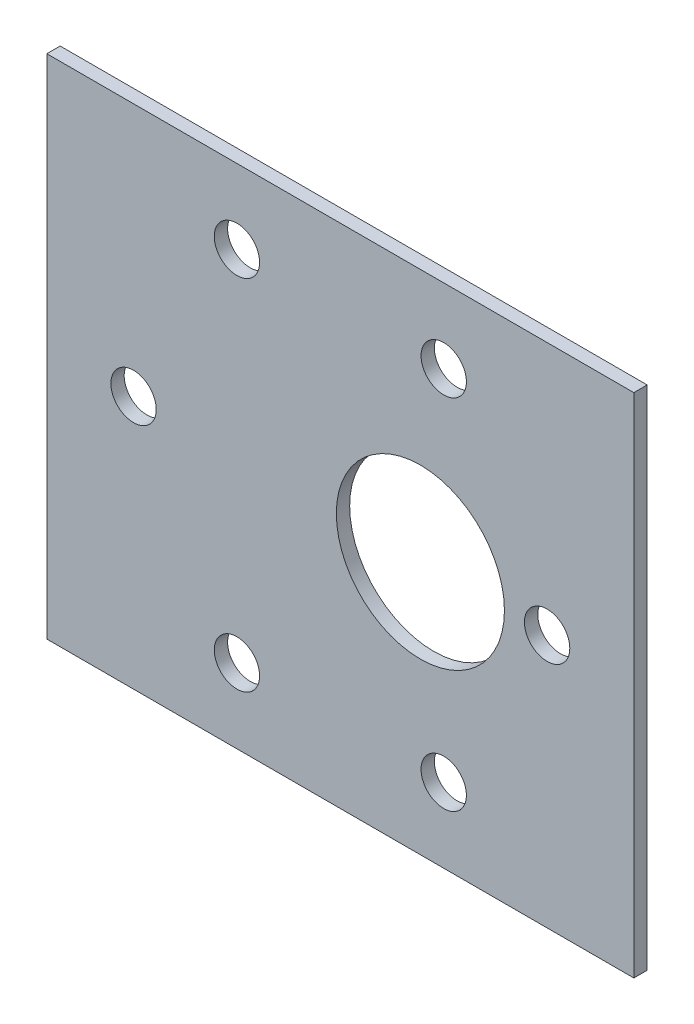
ISO-10303-21;
HEADER;
FILE_DESCRIPTION(('STEP AP214'),'2;1');
FILE_NAME('part.step','',(''),(''),'','','');
FILE_SCHEMA(('AUTOMOTIVE_DESIGN { 1 0 10303 214 1 1 1 1 }'));
ENDSEC;
DATA;
#1=APPLICATION_CONTEXT('core data for automotive mechanical design processes');
#2=APPLICATION_PROTOCOL_DEFINITION('international standard','automotive_design',2000,#1);
#3=PRODUCT_CONTEXT('',#1,'mechanical');
#4=PRODUCT('Part','Part','',(#3));
#5=PRODUCT_RELATED_PRODUCT_CATEGORY('part','',(#4));
#6=PRODUCT_DEFINITION_FORMATION('','',#4);
#7=PRODUCT_DEFINITION_CONTEXT('part definition',#1,'design');
#8=PRODUCT_DEFINITION('design','',#6,#7);
#9=PRODUCT_DEFINITION_SHAPE('','',#8);
#10=(LENGTH_UNIT() NAMED_UNIT(*) SI_UNIT(.MILLI.,.METRE.));
#11=(NAMED_UNIT(*) PLANE_ANGLE_UNIT() SI_UNIT($,.RADIAN.));
#12=(NAMED_UNIT(*) SI_UNIT($,.STERADIAN.) SOLID_ANGLE_UNIT());
#13=UNCERTAINTY_MEASURE_WITH_UNIT(LENGTH_MEASURE(1.E-05),#10,'distance_accuracy_value','');
#14=(GEOMETRIC_REPRESENTATION_CONTEXT(3) GLOBAL_UNCERTAINTY_ASSIGNED_CONTEXT((#13)) GLOBAL_UNIT_ASSIGNED_CONTEXT((#10,
#11,#12)) REPRESENTATION_CONTEXT('',''));
#15=CARTESIAN_POINT('',(0.,0.,0.));
#16=DIRECTION('',(0.,0.,1.));
#17=DIRECTION('',(1.,0.,0.));
#18=AXIS2_PLACEMENT_3D('',#15,#16,#17);
#19=CARTESIAN_POINT('',(0.,0.,1.));
#20=DIRECTION('',(0.,0.,1.));
#21=DIRECTION('',(1.,0.,0.));
#22=AXIS2_PLACEMENT_3D('',#19,#20,#21);
#23=PLANE('',#22);
#24=CARTESIAN_POINT('',(-13.75,15.076606241,1.));
#25=DIRECTION('',(0.,0.,1.));
#26=DIRECTION('',(1.,0.,0.));
#27=AXIS2_PLACEMENT_3D('',#24,#25,#26);
#28=CIRCLE('',#27,1.7);
#29=CARTESIAN_POINT('',(-12.05,15.076606241,1.));
#30=VERTEX_POINT('',#29);
#31=EDGE_CURVE('E145',#30,#30,#28,.T.);
#32=ORIENTED_EDGE('',*,*,#31,.F.);
#33=EDGE_LOOP('',(#32));
#34=FACE_BOUND('',#33,.T.);
#35=CARTESIAN_POINT('',(-13.75,41.923393759,1.));
#36=DIRECTION('',(0.,0.,1.));
#37=DIRECTION('',(1.,0.,0.));
#38=AXIS2_PLACEMENT_3D('',#35,#36,#37);
#39=CIRCLE('',#38,1.7);
#40=CARTESIAN_POINT('',(-12.05,41.923393759,1.));
#41=VERTEX_POINT('',#40);
#42=EDGE_CURVE('E133',#41,#41,#39,.T.);
#43=ORIENTED_EDGE('',*,*,#42,.F.);
#44=EDGE_LOOP('',(#43));
#45=FACE_BOUND('',#44,.T.);
#46=CARTESIAN_POINT('',(9.5,28.5,1.));
#47=DIRECTION('',(0.,0.,1.));
#48=DIRECTION('',(1.,0.,0.));
#49=AXIS2_PLACEMENT_3D('',#46,#47,#48);
#50=CIRCLE('',#49,1.7);
#51=CARTESIAN_POINT('',(11.2,28.5,1.));
#52=VERTEX_POINT('',#51);
#53=EDGE_CURVE('E121',#52,#52,#50,.T.);
#54=ORIENTED_EDGE('',*,*,#53,.F.);
#55=EDGE_LOOP('',(#54));
#56=FACE_BOUND('',#55,.T.);
#57=DIRECTION('',(0.,-1.,0.));
#58=VECTOR('',#57,1.);
#59=CARTESIAN_POINT('',(-28.,47.5,1.));
#60=LINE('',#59,#58);
#61=CARTESIAN_POINT('',(-28.,47.5,1.));
#62=VERTEX_POINT('',#61);
#63=CARTESIAN_POINT('',(-28.,9.5,1.));
#64=VERTEX_POINT('',#63);
#65=EDGE_CURVE('E91',#62,#64,#60,.T.);
#66=ORIENTED_EDGE('',*,*,#65,.T.);
#67=DIRECTION('',(1.,0.,0.));
#68=VECTOR('',#67,1.);
#69=CARTESIAN_POINT('',(-28.,9.5,1.));
#70=LINE('',#69,#68);
#71=CARTESIAN_POINT('',(16.,9.5,1.));
#72=VERTEX_POINT('',#71);
#73=EDGE_CURVE('E86',#64,#72,#70,.T.);
#74=ORIENTED_EDGE('',*,*,#73,.T.);
#75=DIRECTION('',(0.,1.,0.));
#76=VECTOR('',#75,1.);
#77=CARTESIAN_POINT('',(16.,9.5,1.));
#78=LINE('',#77,#76);
#79=CARTESIAN_POINT('',(16.,47.5,1.));
#80=VERTEX_POINT('',#79);
#81=EDGE_CURVE('E89',#72,#80,#78,.T.);
#82=ORIENTED_EDGE('',*,*,#81,.T.);
#83=DIRECTION('',(-1.,0.,0.));
#84=VECTOR('',#83,1.);
#85=CARTESIAN_POINT('',(16.,47.5,1.));
#86=LINE('',#85,#84);
#87=EDGE_CURVE('E56',#80,#62,#86,.T.);
#88=ORIENTED_EDGE('',*,*,#87,.T.);
#89=EDGE_LOOP('',(#66,#74,#82,#88));
#90=FACE_BOUND('',#89,.T.);
#91=CARTESIAN_POINT('',(0.,28.5,1.));
#92=DIRECTION('',(0.,0.,1.));
#93=DIRECTION('',(1.,0.,0.));
#94=AXIS2_PLACEMENT_3D('',#91,#92,#93);
#95=CIRCLE('',#94,6.3);
#96=CARTESIAN_POINT('',(6.3,28.5,1.));
#97=VERTEX_POINT('',#96);
#98=EDGE_CURVE('E106',#97,#97,#95,.T.);
#99=ORIENTED_EDGE('',*,*,#98,.F.);
#100=EDGE_LOOP('',(#99));
#101=FACE_BOUND('',#100,.T.);
#102=CARTESIAN_POINT('',(1.75,41.923393759,1.));
#103=DIRECTION('',(0.,0.,1.));
#104=DIRECTION('',(1.,0.,0.));
#105=AXIS2_PLACEMENT_3D('',#102,#103,#104);
#106=CIRCLE('',#105,1.7);
#107=CARTESIAN_POINT('',(3.45,41.923393759,1.));
#108=VERTEX_POINT('',#107);
#109=EDGE_CURVE('E127',#108,#108,#106,.T.);
#110=ORIENTED_EDGE('',*,*,#109,.F.);
#111=EDGE_LOOP('',(#110));
#112=FACE_BOUND('',#111,.T.);
#113=CARTESIAN_POINT('',(-21.5,28.5,1.));
#114=DIRECTION('',(0.,0.,1.));
#115=DIRECTION('',(1.,0.,0.));
#116=AXIS2_PLACEMENT_3D('',#113,#114,#115);
#117=CIRCLE('',#116,1.7);
#118=CARTESIAN_POINT('',(-19.8,28.5,1.));
#119=VERTEX_POINT('',#118);
#120=EDGE_CURVE('E139',#119,#119,#117,.T.);
#121=ORIENTED_EDGE('',*,*,#120,.F.);
#122=EDGE_LOOP('',(#121));
#123=FACE_BOUND('',#122,.T.);
#124=CARTESIAN_POINT('',(1.75,15.076606241,1.));
#125=DIRECTION('',(0.,0.,1.));
#126=DIRECTION('',(1.,0.,0.));
#127=AXIS2_PLACEMENT_3D('',#124,#125,#126);
#128=CIRCLE('',#127,1.7);
#129=CARTESIAN_POINT('',(3.45,15.076606241,1.));
#130=VERTEX_POINT('',#129);
#131=EDGE_CURVE('E151',#130,#130,#128,.T.);
#132=ORIENTED_EDGE('',*,*,#131,.F.);
#133=EDGE_LOOP('',(#132));
#134=FACE_BOUND('',#133,.T.);
#135=ADVANCED_FACE('F39',(#34,#45,#56,#90,#101,#112,#123,#134),#23,.T.);
#136=CARTESIAN_POINT('',(0.,0.,0.));
#137=DIRECTION('',(0.,0.,1.));
#138=DIRECTION('',(1.,0.,0.));
#139=AXIS2_PLACEMENT_3D('',#136,#137,#138);
#140=PLANE('',#139);
#141=DIRECTION('',(0.,-1.,0.));
#142=VECTOR('',#141,1.);
#143=CARTESIAN_POINT('',(-28.,47.5,0.));
#144=LINE('',#143,#142);
#145=CARTESIAN_POINT('',(-28.,47.5,0.));
#146=VERTEX_POINT('',#145);
#147=CARTESIAN_POINT('',(-28.,9.5,0.));
#148=VERTEX_POINT('',#147);
#149=EDGE_CURVE('E103',#146,#148,#144,.T.);
#150=ORIENTED_EDGE('',*,*,#149,.F.);
#151=DIRECTION('',(-1.,0.,0.));
#152=VECTOR('',#151,1.);
#153=CARTESIAN_POINT('',(16.,47.5,0.));
#154=LINE('',#153,#152);
#155=CARTESIAN_POINT('',(16.,47.5,0.));
#156=VERTEX_POINT('',#155);
#157=EDGE_CURVE('E79',#156,#146,#154,.T.);
#158=ORIENTED_EDGE('',*,*,#157,.F.);
#159=DIRECTION('',(0.,1.,0.));
#160=VECTOR('',#159,1.);
#161=CARTESIAN_POINT('',(16.,9.5,0.));
#162=LINE('',#161,#160);
#163=CARTESIAN_POINT('',(16.,9.5,0.));
#164=VERTEX_POINT('',#163);
#165=EDGE_CURVE('E73',#164,#156,#162,.T.);
#166=ORIENTED_EDGE('',*,*,#165,.F.);
#167=DIRECTION('',(1.,0.,0.));
#168=VECTOR('',#167,1.);
#169=CARTESIAN_POINT('',(-28.,9.5,0.));
#170=LINE('',#169,#168);
#171=EDGE_CURVE('E95',#148,#164,#170,.T.);
#172=ORIENTED_EDGE('',*,*,#171,.F.);
#173=EDGE_LOOP('',(#150,#158,#166,#172));
#174=FACE_BOUND('',#173,.T.);
#175=CARTESIAN_POINT('',(0.,28.5,0.));
#176=DIRECTION('',(0.,0.,1.));
#177=DIRECTION('',(1.,0.,0.));
#178=AXIS2_PLACEMENT_3D('',#175,#176,#177);
#179=CIRCLE('',#178,6.3);
#180=CARTESIAN_POINT('',(6.3,28.5,0.));
#181=VERTEX_POINT('',#180);
#182=EDGE_CURVE('E118',#181,#181,#179,.T.);
#183=ORIENTED_EDGE('',*,*,#182,.T.);
#184=EDGE_LOOP('',(#183));
#185=FACE_BOUND('',#184,.T.);
#186=CARTESIAN_POINT('',(9.5,28.5,0.));
#187=DIRECTION('',(0.,0.,1.));
#188=DIRECTION('',(1.,0.,0.));
#189=AXIS2_PLACEMENT_3D('',#186,#187,#188);
#190=CIRCLE('',#189,1.7);
#191=CARTESIAN_POINT('',(11.2,28.5,0.));
#192=VERTEX_POINT('',#191);
#193=EDGE_CURVE('E124',#192,#192,#190,.T.);
#194=ORIENTED_EDGE('',*,*,#193,.T.);
#195=EDGE_LOOP('',(#194));
#196=FACE_BOUND('',#195,.T.);
#197=CARTESIAN_POINT('',(1.75,41.923393759,0.));
#198=DIRECTION('',(0.,0.,1.));
#199=DIRECTION('',(1.,0.,0.));
#200=AXIS2_PLACEMENT_3D('',#197,#198,#199);
#201=CIRCLE('',#200,1.7);
#202=CARTESIAN_POINT('',(3.45,41.923393759,0.));
#203=VERTEX_POINT('',#202);
#204=EDGE_CURVE('E130',#203,#203,#201,.T.);
#205=ORIENTED_EDGE('',*,*,#204,.T.);
#206=EDGE_LOOP('',(#205));
#207=FACE_BOUND('',#206,.T.);
#208=CARTESIAN_POINT('',(-13.75,41.923393759,0.));
#209=DIRECTION('',(0.,0.,1.));
#210=DIRECTION('',(1.,0.,0.));
#211=AXIS2_PLACEMENT_3D('',#208,#209,#210);
#212=CIRCLE('',#211,1.7);
#213=CARTESIAN_POINT('',(-12.05,41.923393759,0.));
#214=VERTEX_POINT('',#213);
#215=EDGE_CURVE('E136',#214,#214,#212,.T.);
#216=ORIENTED_EDGE('',*,*,#215,.T.);
#217=EDGE_LOOP('',(#216));
#218=FACE_BOUND('',#217,.T.);
#219=CARTESIAN_POINT('',(-21.5,28.5,0.));
#220=DIRECTION('',(0.,0.,1.));
#221=DIRECTION('',(1.,0.,0.));
#222=AXIS2_PLACEMENT_3D('',#219,#220,#221);
#223=CIRCLE('',#222,1.7);
#224=CARTESIAN_POINT('',(-19.8,28.5,0.));
#225=VERTEX_POINT('',#224);
#226=EDGE_CURVE('E142',#225,#225,#223,.T.);
#227=ORIENTED_EDGE('',*,*,#226,.T.);
#228=EDGE_LOOP('',(#227));
#229=FACE_BOUND('',#228,.T.);
#230=CARTESIAN_POINT('',(-13.75,15.076606241,0.));
#231=DIRECTION('',(0.,0.,1.));
#232=DIRECTION('',(1.,0.,0.));
#233=AXIS2_PLACEMENT_3D('',#230,#231,#232);
#234=CIRCLE('',#233,1.7);
#235=CARTESIAN_POINT('',(-12.05,15.076606241,0.));
#236=VERTEX_POINT('',#235);
#237=EDGE_CURVE('E148',#236,#236,#234,.T.);
#238=ORIENTED_EDGE('',*,*,#237,.T.);
#239=EDGE_LOOP('',(#238));
#240=FACE_BOUND('',#239,.T.);
#241=CARTESIAN_POINT('',(1.75,15.076606241,0.));
#242=DIRECTION('',(0.,0.,1.));
#243=DIRECTION('',(1.,0.,0.));
#244=AXIS2_PLACEMENT_3D('',#241,#242,#243);
#245=CIRCLE('',#244,1.7);
#246=CARTESIAN_POINT('',(3.45,15.076606241,0.));
#247=VERTEX_POINT('',#246);
#248=EDGE_CURVE('E154',#247,#247,#245,.T.);
#249=ORIENTED_EDGE('',*,*,#248,.T.);
#250=EDGE_LOOP('',(#249));
#251=FACE_BOUND('',#250,.T.);
#252=ADVANCED_FACE('F114',(#174,#185,#196,#207,#218,#229,#240,#251),#140,.F.);
#253=CARTESIAN_POINT('',(-28.,47.5,1.));
#254=DIRECTION('',(1.,0.,0.));
#255=DIRECTION('',(0.,0.,-1.));
#256=AXIS2_PLACEMENT_3D('',#253,#254,#255);
#257=PLANE('',#256);
#258=ORIENTED_EDGE('',*,*,#149,.T.);
#259=DIRECTION('',(0.,0.,-1.));
#260=VECTOR('',#259,1.);
#261=CARTESIAN_POINT('',(-28.,9.5,1.));
#262=LINE('',#261,#260);
#263=EDGE_CURVE('E11',#64,#148,#262,.T.);
#264=ORIENTED_EDGE('',*,*,#263,.F.);
#265=ORIENTED_EDGE('',*,*,#65,.F.);
#266=DIRECTION('',(0.,0.,-1.));
#267=VECTOR('',#266,1.);
#268=CARTESIAN_POINT('',(-28.,47.5,1.));
#269=LINE('',#268,#267);
#270=EDGE_CURVE('E99',#62,#146,#269,.T.);
#271=ORIENTED_EDGE('',*,*,#270,.T.);
#272=EDGE_LOOP('',(#258,#264,#265,#271));
#273=FACE_BOUND('',#272,.T.);
#274=ADVANCED_FACE('F41',(#273),#257,.F.);
#275=CARTESIAN_POINT('',(-28.,9.5,1.));
#276=DIRECTION('',(0.,1.,0.));
#277=DIRECTION('',(0.,0.,1.));
#278=AXIS2_PLACEMENT_3D('',#275,#276,#277);
#279=PLANE('',#278);
#280=ORIENTED_EDGE('',*,*,#171,.T.);
#281=DIRECTION('',(0.,0.,-1.));
#282=VECTOR('',#281,1.);
#283=CARTESIAN_POINT('',(16.,9.5,1.));
#284=LINE('',#283,#282);
#285=EDGE_CURVE('E48',#72,#164,#284,.T.);
#286=ORIENTED_EDGE('',*,*,#285,.F.);
#287=ORIENTED_EDGE('',*,*,#73,.F.);
#288=ORIENTED_EDGE('',*,*,#263,.T.);
#289=EDGE_LOOP('',(#280,#286,#287,#288));
#290=FACE_BOUND('',#289,.T.);
#291=ADVANCED_FACE('F94',(#290),#279,.F.);
#292=CARTESIAN_POINT('',(16.,9.5,1.));
#293=DIRECTION('',(-1.,0.,0.));
#294=DIRECTION('',(0.,0.,1.));
#295=AXIS2_PLACEMENT_3D('',#292,#293,#294);
#296=PLANE('',#295);
#297=ORIENTED_EDGE('',*,*,#165,.T.);
#298=DIRECTION('',(0.,0.,-1.));
#299=VECTOR('',#298,1.);
#300=CARTESIAN_POINT('',(16.,47.5,1.));
#301=LINE('',#300,#299);
#302=EDGE_CURVE('E96',#80,#156,#301,.T.);
#303=ORIENTED_EDGE('',*,*,#302,.F.);
#304=ORIENTED_EDGE('',*,*,#81,.F.);
#305=ORIENTED_EDGE('',*,*,#285,.T.);
#306=EDGE_LOOP('',(#297,#303,#304,#305));
#307=FACE_BOUND('',#306,.T.);
#308=ADVANCED_FACE('F97',(#307),#296,.F.);
#309=CARTESIAN_POINT('',(16.,47.5,1.));
#310=DIRECTION('',(0.,-1.,0.));
#311=DIRECTION('',(0.,0.,-1.));
#312=AXIS2_PLACEMENT_3D('',#309,#310,#311);
#313=PLANE('',#312);
#314=ORIENTED_EDGE('',*,*,#157,.T.);
#315=ORIENTED_EDGE('',*,*,#270,.F.);
#316=ORIENTED_EDGE('',*,*,#87,.F.);
#317=ORIENTED_EDGE('',*,*,#302,.T.);
#318=EDGE_LOOP('',(#314,#315,#316,#317));
#319=FACE_BOUND('',#318,.T.);
#320=ADVANCED_FACE('F111',(#319),#313,.F.);
#321=CARTESIAN_POINT('',(0.,28.5,1.));
#322=DIRECTION('',(0.,0.,-1.));
#323=DIRECTION('',(-1.,0.,0.));
#324=AXIS2_PLACEMENT_3D('',#321,#322,#323);
#325=CYLINDRICAL_SURFACE('',#324,6.3);
#326=ORIENTED_EDGE('',*,*,#98,.T.);
#327=EDGE_LOOP('',(#326));
#328=FACE_BOUND('',#327,.T.);
#329=ORIENTED_EDGE('',*,*,#182,.F.);
#330=EDGE_LOOP('',(#329));
#331=FACE_BOUND('',#330,.T.);
#332=ADVANCED_FACE('F173',(#328,#331),#325,.F.);
#333=CARTESIAN_POINT('',(9.5,28.5,1.));
#334=DIRECTION('',(0.,0.,-1.));
#335=DIRECTION('',(-1.,0.,0.));
#336=AXIS2_PLACEMENT_3D('',#333,#334,#335);
#337=CYLINDRICAL_SURFACE('',#336,1.7);
#338=ORIENTED_EDGE('',*,*,#53,.T.);
#339=EDGE_LOOP('',(#338));
#340=FACE_BOUND('',#339,.T.);
#341=ORIENTED_EDGE('',*,*,#193,.F.);
#342=EDGE_LOOP('',(#341));
#343=FACE_BOUND('',#342,.T.);
#344=ADVANCED_FACE('F218',(#340,#343),#337,.F.);
#345=CARTESIAN_POINT('',(1.75,41.923393759,1.));
#346=DIRECTION('',(0.,0.,-1.));
#347=DIRECTION('',(-1.,0.,0.));
#348=AXIS2_PLACEMENT_3D('',#345,#346,#347);
#349=CYLINDRICAL_SURFACE('',#348,1.7);
#350=ORIENTED_EDGE('',*,*,#109,.T.);
#351=EDGE_LOOP('',(#350));
#352=FACE_BOUND('',#351,.T.);
#353=ORIENTED_EDGE('',*,*,#204,.F.);
#354=EDGE_LOOP('',(#353));
#355=FACE_BOUND('',#354,.T.);
#356=ADVANCED_FACE('F226',(#352,#355),#349,.F.);
#357=CARTESIAN_POINT('',(-13.75,41.923393759,1.));
#358=DIRECTION('',(0.,0.,-1.));
#359=DIRECTION('',(-1.,0.,0.));
#360=AXIS2_PLACEMENT_3D('',#357,#358,#359);
#361=CYLINDRICAL_SURFACE('',#360,1.7);
#362=ORIENTED_EDGE('',*,*,#42,.T.);
#363=EDGE_LOOP('',(#362));
#364=FACE_BOUND('',#363,.T.);
#365=ORIENTED_EDGE('',*,*,#215,.F.);
#366=EDGE_LOOP('',(#365));
#367=FACE_BOUND('',#366,.T.);
#368=ADVANCED_FACE('F234',(#364,#367),#361,.F.);
#369=CARTESIAN_POINT('',(-21.5,28.5,1.));
#370=DIRECTION('',(0.,0.,-1.));
#371=DIRECTION('',(-1.,0.,0.));
#372=AXIS2_PLACEMENT_3D('',#369,#370,#371);
#373=CYLINDRICAL_SURFACE('',#372,1.7);
#374=ORIENTED_EDGE('',*,*,#120,.T.);
#375=EDGE_LOOP('',(#374));
#376=FACE_BOUND('',#375,.T.);
#377=ORIENTED_EDGE('',*,*,#226,.F.);
#378=EDGE_LOOP('',(#377));
#379=FACE_BOUND('',#378,.T.);
#380=ADVANCED_FACE('F243',(#376,#379),#373,.F.);
#381=CARTESIAN_POINT('',(-13.75,15.076606241,1.));
#382=DIRECTION('',(0.,0.,-1.));
#383=DIRECTION('',(-1.,0.,0.));
#384=AXIS2_PLACEMENT_3D('',#381,#382,#383);
#385=CYLINDRICAL_SURFACE('',#384,1.7);
#386=ORIENTED_EDGE('',*,*,#31,.T.);
#387=EDGE_LOOP('',(#386));
#388=FACE_BOUND('',#387,.T.);
#389=ORIENTED_EDGE('',*,*,#237,.F.);
#390=EDGE_LOOP('',(#389));
#391=FACE_BOUND('',#390,.T.);
#392=ADVANCED_FACE('F252',(#388,#391),#385,.F.);
#393=CARTESIAN_POINT('',(1.75,15.076606241,1.));
#394=DIRECTION('',(0.,0.,-1.));
#395=DIRECTION('',(-1.,0.,0.));
#396=AXIS2_PLACEMENT_3D('',#393,#394,#395);
#397=CYLINDRICAL_SURFACE('',#396,1.7);
#398=ORIENTED_EDGE('',*,*,#131,.T.);
#399=EDGE_LOOP('',(#398));
#400=FACE_BOUND('',#399,.T.);
#401=ORIENTED_EDGE('',*,*,#248,.F.);
#402=EDGE_LOOP('',(#401));
#403=FACE_BOUND('',#402,.T.);
#404=ADVANCED_FACE('F160',(#400,#403),#397,.F.);
#405=CLOSED_SHELL('',(#135,#252,#274,#291,#308,#320,#332,#344,#356,#368,#380,#392,#404));
#406=MANIFOLD_SOLID_BREP('B2',#405);
#407=ADVANCED_BREP_SHAPE_REPRESENTATION('',(#18,#406),#14);
#408=SHAPE_DEFINITION_REPRESENTATION(#9,#407);
ENDSEC;
END-ISO-10303-21;
